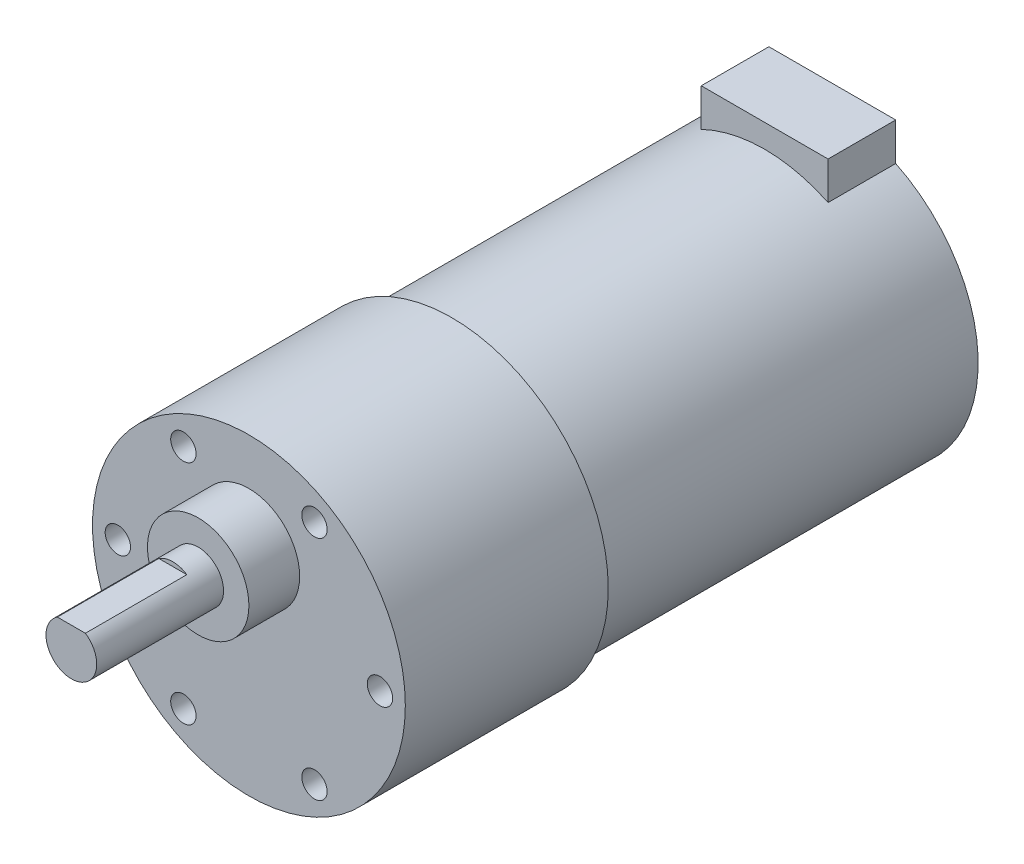
ISO-10303-21;
HEADER;
FILE_DESCRIPTION(('STEP AP214'),'2;1');
FILE_NAME('part.step','',(''),(''),'','','');
FILE_SCHEMA(('AUTOMOTIVE_DESIGN { 1 0 10303 214 1 1 1 1 }'));
ENDSEC;
DATA;
#1=APPLICATION_CONTEXT('core data for automotive mechanical design processes');
#2=APPLICATION_PROTOCOL_DEFINITION('international standard','automotive_design',2000,#1);
#3=PRODUCT_CONTEXT('',#1,'mechanical');
#4=PRODUCT('Part','Part','',(#3));
#5=PRODUCT_RELATED_PRODUCT_CATEGORY('part','',(#4));
#6=PRODUCT_DEFINITION_FORMATION('','',#4);
#7=PRODUCT_DEFINITION_CONTEXT('part definition',#1,'design');
#8=PRODUCT_DEFINITION('design','',#6,#7);
#9=PRODUCT_DEFINITION_SHAPE('','',#8);
#10=(LENGTH_UNIT() NAMED_UNIT(*) SI_UNIT(.MILLI.,.METRE.));
#11=(NAMED_UNIT(*) PLANE_ANGLE_UNIT() SI_UNIT($,.RADIAN.));
#12=(NAMED_UNIT(*) SI_UNIT($,.STERADIAN.) SOLID_ANGLE_UNIT());
#13=UNCERTAINTY_MEASURE_WITH_UNIT(LENGTH_MEASURE(1.E-05),#10,'distance_accuracy_value','');
#14=(GEOMETRIC_REPRESENTATION_CONTEXT(3) GLOBAL_UNCERTAINTY_ASSIGNED_CONTEXT((#13)) GLOBAL_UNIT_ASSIGNED_CONTEXT((#10,
#11,#12)) REPRESENTATION_CONTEXT('',''));
#15=CARTESIAN_POINT('',(0.,0.,0.));
#16=DIRECTION('',(0.,0.,1.));
#17=DIRECTION('',(1.,0.,0.));
#18=AXIS2_PLACEMENT_3D('',#15,#16,#17);
#19=CARTESIAN_POINT('',(0.,0.,-45.));
#20=DIRECTION('',(0.,0.,1.));
#21=DIRECTION('',(1.,0.,0.));
#22=AXIS2_PLACEMENT_3D('',#19,#20,#21);
#23=CYLINDRICAL_SURFACE('',#22,17.25);
#24=CARTESIAN_POINT('',(0.,0.,0.));
#25=DIRECTION('',(0.,0.,-1.));
#26=DIRECTION('',(-1.,0.,0.));
#27=AXIS2_PLACEMENT_3D('',#24,#25,#26);
#28=CIRCLE('',#27,17.25);
#29=CARTESIAN_POINT('',(-17.25,0.,0.));
#30=VERTEX_POINT('',#29);
#31=EDGE_CURVE('E176',#30,#30,#28,.T.);
#32=ORIENTED_EDGE('',*,*,#31,.T.);
#33=EDGE_LOOP('',(#32));
#34=FACE_BOUND('',#33,.T.);
#35=DIRECTION('',(0.,0.,1.));
#36=VECTOR('',#35,1.);
#37=CARTESIAN_POINT('',(-7.5,15.534236382906,-45.));
#38=LINE('',#37,#36);
#39=CARTESIAN_POINT('',(-7.5,15.534236382906,-45.));
#40=VERTEX_POINT('',#39);
#41=CARTESIAN_POINT('',(-7.5,15.534236382906,-37.));
#42=VERTEX_POINT('',#41);
#43=EDGE_CURVE('E115',#40,#42,#38,.T.);
#44=ORIENTED_EDGE('',*,*,#43,.F.);
#45=CARTESIAN_POINT('',(0.,0.,-45.));
#46=DIRECTION('',(0.,0.,-1.));
#47=DIRECTION('',(-1.,0.,0.));
#48=AXIS2_PLACEMENT_3D('',#45,#46,#47);
#49=CIRCLE('',#48,17.25);
#50=CARTESIAN_POINT('',(7.5,15.534236382906,-45.));
#51=VERTEX_POINT('',#50);
#52=EDGE_CURVE('E180',#51,#40,#49,.T.);
#53=ORIENTED_EDGE('',*,*,#52,.F.);
#54=DIRECTION('',(0.,0.,1.));
#55=VECTOR('',#54,1.);
#56=CARTESIAN_POINT('',(7.5,15.534236382906,-45.));
#57=LINE('',#56,#55);
#58=CARTESIAN_POINT('',(7.5,15.534236382906,-37.));
#59=VERTEX_POINT('',#58);
#60=EDGE_CURVE('E116',#59,#51,#57,.F.);
#61=ORIENTED_EDGE('',*,*,#60,.F.);
#62=CARTESIAN_POINT('',(0.,0.,-37.));
#63=DIRECTION('',(0.,0.,-1.));
#64=DIRECTION('',(-1.,0.,0.));
#65=AXIS2_PLACEMENT_3D('',#62,#63,#64);
#66=CIRCLE('',#65,17.25);
#67=EDGE_CURVE('E11',#42,#59,#66,.T.);
#68=ORIENTED_EDGE('',*,*,#67,.F.);
#69=EDGE_LOOP('',(#44,#53,#61,#68));
#70=FACE_BOUND('',#69,.T.);
#71=ADVANCED_FACE('F39',(#34,#70),#23,.T.);
#72=CARTESIAN_POINT('',(0.,0.,24.));
#73=DIRECTION('',(0.,0.,-1.));
#74=DIRECTION('',(-1.,0.,0.));
#75=AXIS2_PLACEMENT_3D('',#72,#73,#74);
#76=CYLINDRICAL_SURFACE('',#75,18.5);
#77=CARTESIAN_POINT('',(0.,0.,24.));
#78=DIRECTION('',(0.,0.,1.));
#79=DIRECTION('',(1.,0.,0.));
#80=AXIS2_PLACEMENT_3D('',#77,#78,#79);
#81=CIRCLE('',#80,18.5);
#82=CARTESIAN_POINT('',(18.5,0.,24.));
#83=VERTEX_POINT('',#82);
#84=EDGE_CURVE('E187',#83,#83,#81,.T.);
#85=ORIENTED_EDGE('',*,*,#84,.F.);
#86=EDGE_LOOP('',(#85));
#87=FACE_BOUND('',#86,.T.);
#88=CARTESIAN_POINT('',(0.,0.,0.));
#89=DIRECTION('',(0.,0.,1.));
#90=DIRECTION('',(1.,0.,0.));
#91=AXIS2_PLACEMENT_3D('',#88,#89,#90);
#92=CIRCLE('',#91,18.5);
#93=CARTESIAN_POINT('',(18.5,0.,0.));
#94=VERTEX_POINT('',#93);
#95=EDGE_CURVE('E184',#94,#94,#92,.T.);
#96=ORIENTED_EDGE('',*,*,#95,.T.);
#97=EDGE_LOOP('',(#96));
#98=FACE_BOUND('',#97,.T.);
#99=ADVANCED_FACE('F41',(#87,#98),#76,.T.);
#100=CARTESIAN_POINT('',(0.,0.,24.));
#101=DIRECTION('',(0.,0.,1.));
#102=DIRECTION('',(1.,0.,0.));
#103=AXIS2_PLACEMENT_3D('',#100,#101,#102);
#104=PLANE('',#103);
#105=CARTESIAN_POINT('',(-7.7500000000001,13.4233937586587,24.));
#106=DIRECTION('',(0.,0.,1.));
#107=DIRECTION('',(1.,0.,0.));
#108=AXIS2_PLACEMENT_3D('',#105,#106,#107);
#109=CIRCLE('',#108,1.5);
#110=CARTESIAN_POINT('',(-6.25000000000009,13.4233937586587,24.));
#111=VERTEX_POINT('',#110);
#112=EDGE_CURVE('E123',#111,#111,#109,.T.);
#113=ORIENTED_EDGE('',*,*,#112,.F.);
#114=EDGE_LOOP('',(#113));
#115=FACE_BOUND('',#114,.T.);
#116=CARTESIAN_POINT('',(-15.5,-1.07552855510562E-13,24.));
#117=DIRECTION('',(0.,0.,1.));
#118=DIRECTION('',(1.,0.,0.));
#119=AXIS2_PLACEMENT_3D('',#116,#117,#118);
#120=CIRCLE('',#119,1.5);
#121=CARTESIAN_POINT('',(-14.,-1.07552855510562E-13,24.));
#122=VERTEX_POINT('',#121);
#123=EDGE_CURVE('E146',#122,#122,#120,.T.);
#124=ORIENTED_EDGE('',*,*,#123,.F.);
#125=EDGE_LOOP('',(#124));
#126=FACE_BOUND('',#125,.T.);
#127=CARTESIAN_POINT('',(-7.74999999999991,-13.4233937586589,24.));
#128=DIRECTION('',(0.,0.,1.));
#129=DIRECTION('',(1.,0.,0.));
#130=AXIS2_PLACEMENT_3D('',#127,#128,#129);
#131=CIRCLE('',#130,1.5);
#132=CARTESIAN_POINT('',(-6.24999999999991,-13.4233937586589,24.));
#133=VERTEX_POINT('',#132);
#134=EDGE_CURVE('E140',#133,#133,#131,.T.);
#135=ORIENTED_EDGE('',*,*,#134,.F.);
#136=EDGE_LOOP('',(#135));
#137=FACE_BOUND('',#136,.T.);
#138=CARTESIAN_POINT('',(7.75000000000009,-13.4233937586588,24.));
#139=DIRECTION('',(0.,0.,1.));
#140=DIRECTION('',(1.,0.,0.));
#141=AXIS2_PLACEMENT_3D('',#138,#139,#140);
#142=CIRCLE('',#141,1.5);
#143=CARTESIAN_POINT('',(9.25000000000009,-13.4233937586588,24.));
#144=VERTEX_POINT('',#143);
#145=EDGE_CURVE('E134',#144,#144,#142,.T.);
#146=ORIENTED_EDGE('',*,*,#145,.F.);
#147=EDGE_LOOP('',(#146));
#148=FACE_BOUND('',#147,.T.);
#149=CARTESIAN_POINT('',(15.5,1.01915004213637E-13,24.));
#150=DIRECTION('',(0.,0.,1.));
#151=DIRECTION('',(1.,0.,0.));
#152=AXIS2_PLACEMENT_3D('',#149,#150,#151);
#153=CIRCLE('',#152,1.5);
#154=CARTESIAN_POINT('',(17.,1.01915004213637E-13,24.));
#155=VERTEX_POINT('',#154);
#156=EDGE_CURVE('E128',#155,#155,#153,.T.);
#157=ORIENTED_EDGE('',*,*,#156,.F.);
#158=EDGE_LOOP('',(#157));
#159=FACE_BOUND('',#158,.T.);
#160=CARTESIAN_POINT('',(7.74999999999992,13.4233937586588,24.));
#161=DIRECTION('',(0.,0.,1.));
#162=DIRECTION('',(1.,0.,0.));
#163=AXIS2_PLACEMENT_3D('',#160,#161,#162);
#164=CIRCLE('',#163,1.5);
#165=CARTESIAN_POINT('',(9.24999999999992,13.4233937586588,24.));
#166=VERTEX_POINT('',#165);
#167=EDGE_CURVE('E127',#166,#166,#164,.T.);
#168=ORIENTED_EDGE('',*,*,#167,.F.);
#169=EDGE_LOOP('',(#168));
#170=FACE_BOUND('',#169,.T.);
#171=CARTESIAN_POINT('',(0.,7.,24.));
#172=DIRECTION('',(0.,0.,1.));
#173=DIRECTION('',(1.,0.,0.));
#174=AXIS2_PLACEMENT_3D('',#171,#172,#173);
#175=CIRCLE('',#174,6.);
#176=CARTESIAN_POINT('',(6.,7.,24.));
#177=VERTEX_POINT('',#176);
#178=EDGE_CURVE('E173',#177,#177,#175,.T.);
#179=ORIENTED_EDGE('',*,*,#178,.F.);
#180=EDGE_LOOP('',(#179));
#181=FACE_BOUND('',#180,.T.);
#182=ORIENTED_EDGE('',*,*,#84,.T.);
#183=EDGE_LOOP('',(#182));
#184=FACE_BOUND('',#183,.T.);
#185=ADVANCED_FACE('F196',(#115,#126,#137,#148,#159,#170,#181,#184),#104,.T.);
#186=CARTESIAN_POINT('',(0.,0.,0.));
#187=DIRECTION('',(0.,0.,1.));
#188=DIRECTION('',(1.,0.,0.));
#189=AXIS2_PLACEMENT_3D('',#186,#187,#188);
#190=PLANE('',#189);
#191=ORIENTED_EDGE('',*,*,#31,.F.);
#192=EDGE_LOOP('',(#191));
#193=FACE_BOUND('',#192,.T.);
#194=ORIENTED_EDGE('',*,*,#95,.F.);
#195=EDGE_LOOP('',(#194));
#196=FACE_BOUND('',#195,.T.);
#197=ADVANCED_FACE('F193',(#193,#196),#190,.F.);
#198=CARTESIAN_POINT('',(0.,0.,-45.));
#199=DIRECTION('',(0.,0.,-1.));
#200=DIRECTION('',(-1.,0.,0.));
#201=AXIS2_PLACEMENT_3D('',#198,#199,#200);
#202=PLANE('',#201);
#203=ORIENTED_EDGE('',*,*,#52,.T.);
#204=DIRECTION('',(0.,-1.,0.));
#205=VECTOR('',#204,1.);
#206=CARTESIAN_POINT('',(-7.5,20.,-45.));
#207=LINE('',#206,#205);
#208=CARTESIAN_POINT('',(-7.5,20.,-45.));
#209=VERTEX_POINT('',#208);
#210=EDGE_CURVE('E458',#209,#40,#207,.T.);
#211=ORIENTED_EDGE('',*,*,#210,.F.);
#212=DIRECTION('',(-1.,0.,0.));
#213=VECTOR('',#212,1.);
#214=CARTESIAN_POINT('',(-7.5,20.,-45.));
#215=LINE('',#214,#213);
#216=CARTESIAN_POINT('',(7.5,20.,-45.));
#217=VERTEX_POINT('',#216);
#218=EDGE_CURVE('E109',#217,#209,#215,.T.);
#219=ORIENTED_EDGE('',*,*,#218,.F.);
#220=DIRECTION('',(0.,-1.,0.));
#221=VECTOR('',#220,1.);
#222=CARTESIAN_POINT('',(7.5,20.,-45.));
#223=LINE('',#222,#221);
#224=EDGE_CURVE('E54',#217,#51,#223,.T.);
#225=ORIENTED_EDGE('',*,*,#224,.T.);
#226=EDGE_LOOP('',(#203,#211,#219,#225));
#227=FACE_BOUND('',#226,.T.);
#228=ADVANCED_FACE('F195',(#227),#202,.T.);
#229=CARTESIAN_POINT('',(0.,7.,30.));
#230=DIRECTION('',(0.,0.,-1.));
#231=DIRECTION('',(-1.,0.,0.));
#232=AXIS2_PLACEMENT_3D('',#229,#230,#231);
#233=CYLINDRICAL_SURFACE('',#232,6.);
#234=CARTESIAN_POINT('',(0.,7.,30.));
#235=DIRECTION('',(0.,0.,1.));
#236=DIRECTION('',(1.,0.,0.));
#237=AXIS2_PLACEMENT_3D('',#234,#235,#236);
#238=CIRCLE('',#237,6.);
#239=CARTESIAN_POINT('',(6.,7.,30.));
#240=VERTEX_POINT('',#239);
#241=EDGE_CURVE('E177',#240,#240,#238,.T.);
#242=ORIENTED_EDGE('',*,*,#241,.F.);
#243=EDGE_LOOP('',(#242));
#244=FACE_BOUND('',#243,.T.);
#245=ORIENTED_EDGE('',*,*,#178,.T.);
#246=EDGE_LOOP('',(#245));
#247=FACE_BOUND('',#246,.T.);
#248=ADVANCED_FACE('F203',(#244,#247),#233,.T.);
#249=CARTESIAN_POINT('',(0.,7.,30.));
#250=DIRECTION('',(0.,0.,1.));
#251=DIRECTION('',(1.,0.,0.));
#252=AXIS2_PLACEMENT_3D('',#249,#250,#251);
#253=PLANE('',#252);
#254=CARTESIAN_POINT('',(0.,7.,30.));
#255=DIRECTION('',(0.,0.,1.));
#256=DIRECTION('',(1.,0.,0.));
#257=AXIS2_PLACEMENT_3D('',#254,#255,#256);
#258=CIRCLE('',#257,3.);
#259=CARTESIAN_POINT('',(3.,7.,30.));
#260=VERTEX_POINT('',#259);
#261=EDGE_CURVE('E47',#260,#260,#258,.T.);
#262=ORIENTED_EDGE('',*,*,#261,.F.);
#263=EDGE_LOOP('',(#262));
#264=FACE_BOUND('',#263,.T.);
#265=ORIENTED_EDGE('',*,*,#241,.T.);
#266=EDGE_LOOP('',(#265));
#267=FACE_BOUND('',#266,.T.);
#268=ADVANCED_FACE('F220',(#264,#267),#253,.T.);
#269=CARTESIAN_POINT('',(0.,7.,45.));
#270=DIRECTION('',(0.,0.,-1.));
#271=DIRECTION('',(-1.,0.,0.));
#272=AXIS2_PLACEMENT_3D('',#269,#270,#271);
#273=CYLINDRICAL_SURFACE('',#272,3.);
#274=CARTESIAN_POINT('',(0.,7.,45.));
#275=DIRECTION('',(0.,0.,1.));
#276=DIRECTION('',(1.,0.,0.));
#277=AXIS2_PLACEMENT_3D('',#274,#275,#276);
#278=CIRCLE('',#277,3.);
#279=CARTESIAN_POINT('',(-1.6583123951777,9.5,45.));
#280=VERTEX_POINT('',#279);
#281=CARTESIAN_POINT('',(1.6583123951777,9.5,45.));
#282=VERTEX_POINT('',#281);
#283=EDGE_CURVE('E169',#280,#282,#278,.T.);
#284=ORIENTED_EDGE('',*,*,#283,.F.);
#285=DIRECTION('',(0.,0.,1.));
#286=VECTOR('',#285,1.);
#287=CARTESIAN_POINT('',(-1.6583123951777,9.5,33.));
#288=LINE('',#287,#286);
#289=CARTESIAN_POINT('',(-1.6583123951777,9.5,33.));
#290=VERTEX_POINT('',#289);
#291=EDGE_CURVE('E62',#290,#280,#288,.T.);
#292=ORIENTED_EDGE('',*,*,#291,.F.);
#293=CARTESIAN_POINT('',(0.,7.,33.));
#294=DIRECTION('',(0.,0.,1.));
#295=DIRECTION('',(1.,0.,0.));
#296=AXIS2_PLACEMENT_3D('',#293,#294,#295);
#297=CIRCLE('',#296,3.);
#298=CARTESIAN_POINT('',(1.6583123951777,9.5,33.));
#299=VERTEX_POINT('',#298);
#300=EDGE_CURVE('E160',#299,#290,#297,.T.);
#301=ORIENTED_EDGE('',*,*,#300,.F.);
#302=DIRECTION('',(0.,0.,1.));
#303=VECTOR('',#302,1.);
#304=CARTESIAN_POINT('',(1.6583123951777,9.5,33.));
#305=LINE('',#304,#303);
#306=EDGE_CURVE('E166',#299,#282,#305,.T.);
#307=ORIENTED_EDGE('',*,*,#306,.T.);
#308=EDGE_LOOP('',(#284,#292,#301,#307));
#309=FACE_BOUND('',#308,.T.);
#310=ORIENTED_EDGE('',*,*,#261,.T.);
#311=EDGE_LOOP('',(#310));
#312=FACE_BOUND('',#311,.T.);
#313=ADVANCED_FACE('F224',(#309,#312),#273,.T.);
#314=CARTESIAN_POINT('',(0.,7.,45.));
#315=DIRECTION('',(0.,0.,1.));
#316=DIRECTION('',(1.,0.,0.));
#317=AXIS2_PLACEMENT_3D('',#314,#315,#316);
#318=PLANE('',#317);
#319=DIRECTION('',(1.,0.,0.));
#320=VECTOR('',#319,1.);
#321=CARTESIAN_POINT('',(0.,9.5,45.));
#322=LINE('',#321,#320);
#323=EDGE_CURVE('E157',#280,#282,#322,.T.);
#324=ORIENTED_EDGE('',*,*,#323,.F.);
#325=ORIENTED_EDGE('',*,*,#283,.T.);
#326=EDGE_LOOP('',(#324,#325));
#327=FACE_BOUND('',#326,.T.);
#328=ADVANCED_FACE('F228',(#327),#318,.T.);
#329=CARTESIAN_POINT('',(0.,9.5,33.));
#330=DIRECTION('',(0.,-1.,0.));
#331=DIRECTION('',(0.,0.,-1.));
#332=AXIS2_PLACEMENT_3D('',#329,#330,#331);
#333=PLANE('',#332);
#334=ORIENTED_EDGE('',*,*,#323,.T.);
#335=ORIENTED_EDGE('',*,*,#306,.F.);
#336=DIRECTION('',(1.,0.,0.));
#337=VECTOR('',#336,1.);
#338=CARTESIAN_POINT('',(0.,9.5,33.));
#339=LINE('',#338,#337);
#340=EDGE_CURVE('E162',#290,#299,#339,.T.);
#341=ORIENTED_EDGE('',*,*,#340,.F.);
#342=ORIENTED_EDGE('',*,*,#291,.T.);
#343=EDGE_LOOP('',(#334,#335,#341,#342));
#344=FACE_BOUND('',#343,.T.);
#345=ADVANCED_FACE('F232',(#344),#333,.F.);
#346=CARTESIAN_POINT('',(0.,0.,33.));
#347=DIRECTION('',(0.,0.,1.));
#348=DIRECTION('',(1.,0.,0.));
#349=AXIS2_PLACEMENT_3D('',#346,#347,#348);
#350=PLANE('',#349);
#351=ORIENTED_EDGE('',*,*,#300,.T.);
#352=ORIENTED_EDGE('',*,*,#340,.T.);
#353=EDGE_LOOP('',(#351,#352));
#354=FACE_BOUND('',#353,.T.);
#355=ADVANCED_FACE('F236',(#354),#350,.T.);
#356=CARTESIAN_POINT('',(7.74999999999992,13.4233937586588,21.));
#357=DIRECTION('',(0.,0.,1.));
#358=DIRECTION('',(1.,0.,0.));
#359=AXIS2_PLACEMENT_3D('',#356,#357,#358);
#360=CYLINDRICAL_SURFACE('',#359,1.5);
#361=CARTESIAN_POINT('',(7.74999999999992,13.4233937586588,21.));
#362=DIRECTION('',(0.,0.,1.));
#363=DIRECTION('',(1.,0.,0.));
#364=AXIS2_PLACEMENT_3D('',#361,#362,#363);
#365=CIRCLE('',#364,1.5);
#366=CARTESIAN_POINT('',(9.24999999999992,13.4233937586588,21.));
#367=VERTEX_POINT('',#366);
#368=EDGE_CURVE('E154',#367,#367,#365,.T.);
#369=ORIENTED_EDGE('',*,*,#368,.F.);
#370=EDGE_LOOP('',(#369));
#371=FACE_BOUND('',#370,.T.);
#372=ORIENTED_EDGE('',*,*,#167,.T.);
#373=EDGE_LOOP('',(#372));
#374=FACE_BOUND('',#373,.T.);
#375=ADVANCED_FACE('F239',(#371,#374),#360,.F.);
#376=CARTESIAN_POINT('',(7.74999999999992,13.4233937586588,21.));
#377=DIRECTION('',(0.,0.,1.));
#378=DIRECTION('',(1.,0.,0.));
#379=AXIS2_PLACEMENT_3D('',#376,#377,#378);
#380=PLANE('',#379);
#381=ORIENTED_EDGE('',*,*,#368,.T.);
#382=EDGE_LOOP('',(#381));
#383=FACE_BOUND('',#382,.T.);
#384=ADVANCED_FACE('F243',(#383),#380,.T.);
#385=CARTESIAN_POINT('',(15.5,1.01915004213637E-13,21.));
#386=DIRECTION('',(0.,0.,1.));
#387=DIRECTION('',(1.,0.,0.));
#388=AXIS2_PLACEMENT_3D('',#385,#386,#387);
#389=CYLINDRICAL_SURFACE('',#388,1.5);
#390=CARTESIAN_POINT('',(15.5,1.01915004213637E-13,21.));
#391=DIRECTION('',(0.,0.,1.));
#392=DIRECTION('',(1.,0.,0.));
#393=AXIS2_PLACEMENT_3D('',#390,#391,#392);
#394=CIRCLE('',#393,1.5);
#395=CARTESIAN_POINT('',(17.,1.01915004213637E-13,21.));
#396=VERTEX_POINT('',#395);
#397=EDGE_CURVE('E124',#396,#396,#394,.T.);
#398=ORIENTED_EDGE('',*,*,#397,.F.);
#399=EDGE_LOOP('',(#398));
#400=FACE_BOUND('',#399,.T.);
#401=ORIENTED_EDGE('',*,*,#156,.T.);
#402=EDGE_LOOP('',(#401));
#403=FACE_BOUND('',#402,.T.);
#404=ADVANCED_FACE('F247',(#400,#403),#389,.F.);
#405=CARTESIAN_POINT('',(15.5,1.01915004213637E-13,21.));
#406=DIRECTION('',(0.,0.,1.));
#407=DIRECTION('',(1.,0.,0.));
#408=AXIS2_PLACEMENT_3D('',#405,#406,#407);
#409=PLANE('',#408);
#410=ORIENTED_EDGE('',*,*,#397,.T.);
#411=EDGE_LOOP('',(#410));
#412=FACE_BOUND('',#411,.T.);
#413=ADVANCED_FACE('F277',(#412),#409,.T.);
#414=CARTESIAN_POINT('',(7.75000000000009,-13.4233937586588,21.));
#415=DIRECTION('',(0.,0.,1.));
#416=DIRECTION('',(1.,0.,0.));
#417=AXIS2_PLACEMENT_3D('',#414,#415,#416);
#418=CYLINDRICAL_SURFACE('',#417,1.5);
#419=CARTESIAN_POINT('',(7.75000000000009,-13.4233937586588,21.));
#420=DIRECTION('',(0.,0.,1.));
#421=DIRECTION('',(1.,0.,0.));
#422=AXIS2_PLACEMENT_3D('',#419,#420,#421);
#423=CIRCLE('',#422,1.5);
#424=CARTESIAN_POINT('',(9.25000000000009,-13.4233937586588,21.));
#425=VERTEX_POINT('',#424);
#426=EDGE_CURVE('E131',#425,#425,#423,.T.);
#427=ORIENTED_EDGE('',*,*,#426,.F.);
#428=EDGE_LOOP('',(#427));
#429=FACE_BOUND('',#428,.T.);
#430=ORIENTED_EDGE('',*,*,#145,.T.);
#431=EDGE_LOOP('',(#430));
#432=FACE_BOUND('',#431,.T.);
#433=ADVANCED_FACE('F274',(#429,#432),#418,.F.);
#434=CARTESIAN_POINT('',(7.75000000000009,-13.4233937586588,21.));
#435=DIRECTION('',(0.,0.,1.));
#436=DIRECTION('',(1.,0.,0.));
#437=AXIS2_PLACEMENT_3D('',#434,#435,#436);
#438=PLANE('',#437);
#439=ORIENTED_EDGE('',*,*,#426,.T.);
#440=EDGE_LOOP('',(#439));
#441=FACE_BOUND('',#440,.T.);
#442=ADVANCED_FACE('F269',(#441),#438,.T.);
#443=CARTESIAN_POINT('',(-7.74999999999991,-13.4233937586589,21.));
#444=DIRECTION('',(0.,0.,1.));
#445=DIRECTION('',(1.,0.,0.));
#446=AXIS2_PLACEMENT_3D('',#443,#444,#445);
#447=CYLINDRICAL_SURFACE('',#446,1.5);
#448=CARTESIAN_POINT('',(-7.74999999999991,-13.4233937586589,21.));
#449=DIRECTION('',(0.,0.,1.));
#450=DIRECTION('',(1.,0.,0.));
#451=AXIS2_PLACEMENT_3D('',#448,#449,#450);
#452=CIRCLE('',#451,1.5);
#453=CARTESIAN_POINT('',(-6.24999999999991,-13.4233937586589,21.));
#454=VERTEX_POINT('',#453);
#455=EDGE_CURVE('E137',#454,#454,#452,.T.);
#456=ORIENTED_EDGE('',*,*,#455,.F.);
#457=EDGE_LOOP('',(#456));
#458=FACE_BOUND('',#457,.T.);
#459=ORIENTED_EDGE('',*,*,#134,.T.);
#460=EDGE_LOOP('',(#459));
#461=FACE_BOUND('',#460,.T.);
#462=ADVANCED_FACE('F266',(#458,#461),#447,.F.);
#463=CARTESIAN_POINT('',(-7.74999999999991,-13.4233937586589,21.));
#464=DIRECTION('',(0.,0.,1.));
#465=DIRECTION('',(1.,0.,0.));
#466=AXIS2_PLACEMENT_3D('',#463,#464,#465);
#467=PLANE('',#466);
#468=ORIENTED_EDGE('',*,*,#455,.T.);
#469=EDGE_LOOP('',(#468));
#470=FACE_BOUND('',#469,.T.);
#471=ADVANCED_FACE('F261',(#470),#467,.T.);
#472=CARTESIAN_POINT('',(-15.5,-1.07552855510562E-13,21.));
#473=DIRECTION('',(0.,0.,1.));
#474=DIRECTION('',(1.,0.,0.));
#475=AXIS2_PLACEMENT_3D('',#472,#473,#474);
#476=CYLINDRICAL_SURFACE('',#475,1.5);
#477=CARTESIAN_POINT('',(-15.5,-1.07552855510562E-13,21.));
#478=DIRECTION('',(0.,0.,1.));
#479=DIRECTION('',(1.,0.,0.));
#480=AXIS2_PLACEMENT_3D('',#477,#478,#479);
#481=CIRCLE('',#480,1.5);
#482=CARTESIAN_POINT('',(-14.,-1.07552855510562E-13,21.));
#483=VERTEX_POINT('',#482);
#484=EDGE_CURVE('E143',#483,#483,#481,.T.);
#485=ORIENTED_EDGE('',*,*,#484,.F.);
#486=EDGE_LOOP('',(#485));
#487=FACE_BOUND('',#486,.T.);
#488=ORIENTED_EDGE('',*,*,#123,.T.);
#489=EDGE_LOOP('',(#488));
#490=FACE_BOUND('',#489,.T.);
#491=ADVANCED_FACE('F258',(#487,#490),#476,.F.);
#492=CARTESIAN_POINT('',(-15.5,-1.07552855510562E-13,21.));
#493=DIRECTION('',(0.,0.,1.));
#494=DIRECTION('',(1.,0.,0.));
#495=AXIS2_PLACEMENT_3D('',#492,#493,#494);
#496=PLANE('',#495);
#497=ORIENTED_EDGE('',*,*,#484,.T.);
#498=EDGE_LOOP('',(#497));
#499=FACE_BOUND('',#498,.T.);
#500=ADVANCED_FACE('F253',(#499),#496,.T.);
#501=CARTESIAN_POINT('',(-7.7500000000001,13.4233937586587,21.));
#502=DIRECTION('',(0.,0.,1.));
#503=DIRECTION('',(1.,0.,0.));
#504=AXIS2_PLACEMENT_3D('',#501,#502,#503);
#505=CYLINDRICAL_SURFACE('',#504,1.5);
#506=CARTESIAN_POINT('',(-7.7500000000001,13.4233937586587,21.));
#507=DIRECTION('',(0.,0.,1.));
#508=DIRECTION('',(1.,0.,0.));
#509=AXIS2_PLACEMENT_3D('',#506,#507,#508);
#510=CIRCLE('',#509,1.5);
#511=CARTESIAN_POINT('',(-6.25000000000009,13.4233937586587,21.));
#512=VERTEX_POINT('',#511);
#513=EDGE_CURVE('E149',#512,#512,#510,.T.);
#514=ORIENTED_EDGE('',*,*,#513,.F.);
#515=EDGE_LOOP('',(#514));
#516=FACE_BOUND('',#515,.T.);
#517=ORIENTED_EDGE('',*,*,#112,.T.);
#518=EDGE_LOOP('',(#517));
#519=FACE_BOUND('',#518,.T.);
#520=ADVANCED_FACE('F249',(#516,#519),#505,.F.);
#521=CARTESIAN_POINT('',(-7.7500000000001,13.4233937586587,21.));
#522=DIRECTION('',(0.,0.,1.));
#523=DIRECTION('',(1.,0.,0.));
#524=AXIS2_PLACEMENT_3D('',#521,#522,#523);
#525=PLANE('',#524);
#526=ORIENTED_EDGE('',*,*,#513,.T.);
#527=EDGE_LOOP('',(#526));
#528=FACE_BOUND('',#527,.T.);
#529=ADVANCED_FACE('F252',(#528),#525,.T.);
#530=CARTESIAN_POINT('',(-7.5,20.,-45.));
#531=DIRECTION('',(1.,0.,0.));
#532=DIRECTION('',(0.,0.,-1.));
#533=AXIS2_PLACEMENT_3D('',#530,#531,#532);
#534=PLANE('',#533);
#535=ORIENTED_EDGE('',*,*,#210,.T.);
#536=ORIENTED_EDGE('',*,*,#43,.T.);
#537=DIRECTION('',(0.,-1.,0.));
#538=VECTOR('',#537,1.);
#539=CARTESIAN_POINT('',(-7.5,20.,-37.));
#540=LINE('',#539,#538);
#541=CARTESIAN_POINT('',(-7.5,20.,-37.));
#542=VERTEX_POINT('',#541);
#543=EDGE_CURVE('E98',#542,#42,#540,.T.);
#544=ORIENTED_EDGE('',*,*,#543,.F.);
#545=DIRECTION('',(0.,0.,1.));
#546=VECTOR('',#545,1.);
#547=CARTESIAN_POINT('',(-7.5,20.,-45.));
#548=LINE('',#547,#546);
#549=EDGE_CURVE('E105',#209,#542,#548,.T.);
#550=ORIENTED_EDGE('',*,*,#549,.F.);
#551=EDGE_LOOP('',(#535,#536,#544,#550));
#552=FACE_BOUND('',#551,.T.);
#553=ADVANCED_FACE('F113',(#552),#534,.F.);
#554=CARTESIAN_POINT('',(7.5,20.,-45.));
#555=DIRECTION('',(-1.,0.,0.));
#556=DIRECTION('',(0.,0.,1.));
#557=AXIS2_PLACEMENT_3D('',#554,#555,#556);
#558=PLANE('',#557);
#559=DIRECTION('',(0.,-1.,0.));
#560=VECTOR('',#559,1.);
#561=CARTESIAN_POINT('',(7.5,20.,-37.));
#562=LINE('',#561,#560);
#563=CARTESIAN_POINT('',(7.5,20.,-37.));
#564=VERTEX_POINT('',#563);
#565=EDGE_CURVE('E101',#564,#59,#562,.T.);
#566=ORIENTED_EDGE('',*,*,#565,.T.);
#567=ORIENTED_EDGE('',*,*,#60,.T.);
#568=ORIENTED_EDGE('',*,*,#224,.F.);
#569=DIRECTION('',(0.,0.,-1.));
#570=VECTOR('',#569,1.);
#571=CARTESIAN_POINT('',(7.5,20.,-45.));
#572=LINE('',#571,#570);
#573=EDGE_CURVE('E104',#564,#217,#572,.T.);
#574=ORIENTED_EDGE('',*,*,#573,.F.);
#575=EDGE_LOOP('',(#566,#567,#568,#574));
#576=FACE_BOUND('',#575,.T.);
#577=ADVANCED_FACE('F290',(#576),#558,.F.);
#578=CARTESIAN_POINT('',(-7.5,20.,-37.));
#579=DIRECTION('',(0.,0.,-1.));
#580=DIRECTION('',(-1.,0.,0.));
#581=AXIS2_PLACEMENT_3D('',#578,#579,#580);
#582=PLANE('',#581);
#583=ORIENTED_EDGE('',*,*,#543,.T.);
#584=ORIENTED_EDGE('',*,*,#67,.T.);
#585=ORIENTED_EDGE('',*,*,#565,.F.);
#586=DIRECTION('',(1.,0.,0.));
#587=VECTOR('',#586,1.);
#588=CARTESIAN_POINT('',(-7.5,20.,-37.));
#589=LINE('',#588,#587);
#590=EDGE_CURVE('E94',#542,#564,#589,.T.);
#591=ORIENTED_EDGE('',*,*,#590,.F.);
#592=EDGE_LOOP('',(#583,#584,#585,#591));
#593=FACE_BOUND('',#592,.T.);
#594=ADVANCED_FACE('F96',(#593),#582,.F.);
#595=CARTESIAN_POINT('',(0.,20.,0.));
#596=DIRECTION('',(0.,1.,0.));
#597=DIRECTION('',(0.,0.,1.));
#598=AXIS2_PLACEMENT_3D('',#595,#596,#597);
#599=PLANE('',#598);
#600=ORIENTED_EDGE('',*,*,#549,.T.);
#601=ORIENTED_EDGE('',*,*,#590,.T.);
#602=ORIENTED_EDGE('',*,*,#573,.T.);
#603=ORIENTED_EDGE('',*,*,#218,.T.);
#604=EDGE_LOOP('',(#600,#601,#602,#603));
#605=FACE_BOUND('',#604,.T.);
#606=ADVANCED_FACE('F108',(#605),#599,.T.);
#607=CLOSED_SHELL('',(#71,#99,#185,#197,#228,#248,#268,#313,#328,#345,#355,#375,#384,#404,#413,
#433,#442,#462,#471,#491,#500,#520,#529,#553,#577,#594,#606));
#608=MANIFOLD_SOLID_BREP('B2',#607);
#609=ADVANCED_BREP_SHAPE_REPRESENTATION('',(#18,#608),#14);
#610=SHAPE_DEFINITION_REPRESENTATION(#9,#609);
ENDSEC;
END-ISO-10303-21;
